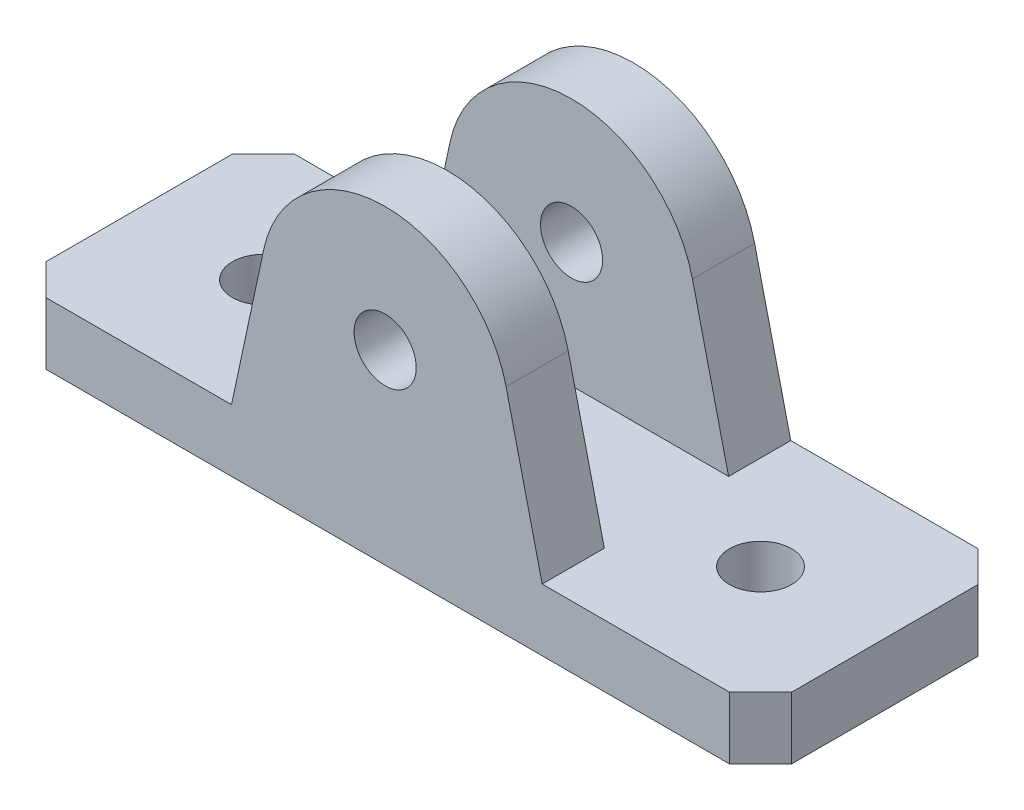
ISO-10303-21;
HEADER;
FILE_DESCRIPTION(('STEP AP214'),'2;1');
FILE_NAME('part.step','',(''),(''),'','','');
FILE_SCHEMA(('AUTOMOTIVE_DESIGN { 1 0 10303 214 1 1 1 1 }'));
ENDSEC;
DATA;
#1=APPLICATION_CONTEXT('core data for automotive mechanical design processes');
#2=APPLICATION_PROTOCOL_DEFINITION('international standard','automotive_design',2000,#1);
#3=PRODUCT_CONTEXT('',#1,'mechanical');
#4=PRODUCT('Part','Part','',(#3));
#5=PRODUCT_RELATED_PRODUCT_CATEGORY('part','',(#4));
#6=PRODUCT_DEFINITION_FORMATION('','',#4);
#7=PRODUCT_DEFINITION_CONTEXT('part definition',#1,'design');
#8=PRODUCT_DEFINITION('design','',#6,#7);
#9=PRODUCT_DEFINITION_SHAPE('','',#8);
#10=(LENGTH_UNIT() NAMED_UNIT(*) SI_UNIT(.MILLI.,.METRE.));
#11=(NAMED_UNIT(*) PLANE_ANGLE_UNIT() SI_UNIT($,.RADIAN.));
#12=(NAMED_UNIT(*) SI_UNIT($,.STERADIAN.) SOLID_ANGLE_UNIT());
#13=UNCERTAINTY_MEASURE_WITH_UNIT(LENGTH_MEASURE(1.E-05),#10,'distance_accuracy_value','');
#14=(GEOMETRIC_REPRESENTATION_CONTEXT(3) GLOBAL_UNCERTAINTY_ASSIGNED_CONTEXT((#13)) GLOBAL_UNIT_ASSIGNED_CONTEXT((#10,
#11,#12)) REPRESENTATION_CONTEXT('',''));
#15=CARTESIAN_POINT('',(0.,0.,0.));
#16=DIRECTION('',(0.,0.,1.));
#17=DIRECTION('',(1.,0.,0.));
#18=AXIS2_PLACEMENT_3D('',#15,#16,#17);
#19=CARTESIAN_POINT('',(-0.0602082119605798,11.8200017497807,0.));
#20=DIRECTION('',(0.,1.,0.));
#21=DIRECTION('',(0.,0.,1.));
#22=AXIS2_PLACEMENT_3D('',#19,#20,#21);
#23=PLANE('',#22);
#24=CARTESIAN_POINT('',(19.9397917880394,11.8200017497807,0.));
#25=DIRECTION('',(0.,1.,0.));
#26=DIRECTION('',(0.,0.,1.));
#27=AXIS2_PLACEMENT_3D('',#24,#25,#26);
#28=CIRCLE('',#27,2.5);
#29=CARTESIAN_POINT('',(19.9397917880394,11.8200017497807,2.49999999999999));
#30=VERTEX_POINT('',#29);
#31=EDGE_CURVE('E543',#30,#30,#28,.T.);
#32=ORIENTED_EDGE('',*,*,#31,.F.);
#33=EDGE_LOOP('',(#32));
#34=FACE_BOUND('',#33,.T.);
#35=CARTESIAN_POINT('',(-20.0602082119606,11.8200017497807,0.));
#36=DIRECTION('',(0.,1.,0.));
#37=DIRECTION('',(0.,0.,-1.));
#38=AXIS2_PLACEMENT_3D('',#35,#36,#37);
#39=CIRCLE('',#38,2.5);
#40=CARTESIAN_POINT('',(-20.0602082119606,11.8200017497807,-2.5));
#41=VERTEX_POINT('',#40);
#42=EDGE_CURVE('E552',#41,#41,#39,.T.);
#43=ORIENTED_EDGE('',*,*,#42,.F.);
#44=EDGE_LOOP('',(#43));
#45=FACE_BOUND('',#44,.T.);
#46=DIRECTION('',(-1.,0.,0.));
#47=VECTOR('',#46,1.);
#48=CARTESIAN_POINT('',(29.9397917880394,11.8200017497807,-10.));
#49=LINE('',#48,#47);
#50=CARTESIAN_POINT('',(-12.6297461845809,11.8200017497807,-10.));
#51=VERTEX_POINT('',#50);
#52=CARTESIAN_POINT('',(-27.5602082119606,11.8200017497807,-10.));
#53=VERTEX_POINT('',#52);
#54=EDGE_CURVE('E243',#51,#53,#49,.T.);
#55=ORIENTED_EDGE('',*,*,#54,.T.);
#56=DIRECTION('',(0.70710678118655,0.,-0.707106781186546));
#57=VECTOR('',#56,1.);
#58=CARTESIAN_POINT('',(-18.8102082119605,11.8200017497807,-18.75));
#59=LINE('',#58,#57);
#60=CARTESIAN_POINT('',(-30.0602082119606,11.8200017497807,-7.50000000000001));
#61=VERTEX_POINT('',#60);
#62=EDGE_CURVE('E278',#53,#61,#59,.F.);
#63=ORIENTED_EDGE('',*,*,#62,.T.);
#64=DIRECTION('',(0.,0.,1.));
#65=VECTOR('',#64,1.);
#66=CARTESIAN_POINT('',(-30.0602082119606,11.8200017497807,10.));
#67=LINE('',#66,#65);
#68=CARTESIAN_POINT('',(-30.0602082119606,11.8200017497807,7.5));
#69=VERTEX_POINT('',#68);
#70=EDGE_CURVE('E234',#61,#69,#67,.T.);
#71=ORIENTED_EDGE('',*,*,#70,.T.);
#72=DIRECTION('',(-0.707106781186547,0.,-0.707106781186549));
#73=VECTOR('',#72,1.);
#74=CARTESIAN_POINT('',(-18.8102082119606,11.8200017497807,18.75));
#75=LINE('',#74,#73);
#76=CARTESIAN_POINT('',(-27.5602082119606,11.8200017497807,10.));
#77=VERTEX_POINT('',#76);
#78=EDGE_CURVE('E276',#69,#77,#75,.F.);
#79=ORIENTED_EDGE('',*,*,#78,.T.);
#80=DIRECTION('',(1.,0.,0.));
#81=VECTOR('',#80,1.);
#82=CARTESIAN_POINT('',(29.9397917880394,11.8200017497807,9.99999999999999));
#83=LINE('',#82,#81);
#84=CARTESIAN_POINT('',(-12.6297461845809,11.8200017497807,10.));
#85=VERTEX_POINT('',#84);
#86=EDGE_CURVE('E239',#77,#85,#83,.T.);
#87=ORIENTED_EDGE('',*,*,#86,.T.);
#88=DIRECTION('',(0.,0.,1.));
#89=VECTOR('',#88,1.);
#90=CARTESIAN_POINT('',(-12.6297461845809,11.8200017497807,5.));
#91=LINE('',#90,#89);
#92=CARTESIAN_POINT('',(-12.6297461845809,11.8200017497807,5.));
#93=VERTEX_POINT('',#92);
#94=EDGE_CURVE('E230',#93,#85,#91,.T.);
#95=ORIENTED_EDGE('',*,*,#94,.F.);
#96=DIRECTION('',(1.,0.,0.));
#97=VECTOR('',#96,1.);
#98=CARTESIAN_POINT('',(12.3702538154191,11.8200017497807,5.));
#99=LINE('',#98,#97);
#100=CARTESIAN_POINT('',(12.3702538154191,11.8200017497807,5.));
#101=VERTEX_POINT('',#100);
#102=EDGE_CURVE('E210',#93,#101,#99,.T.);
#103=ORIENTED_EDGE('',*,*,#102,.T.);
#104=DIRECTION('',(0.,0.,1.));
#105=VECTOR('',#104,1.);
#106=CARTESIAN_POINT('',(12.3702538154191,11.8200017497807,5.));
#107=LINE('',#106,#105);
#108=CARTESIAN_POINT('',(12.3702538154191,11.8200017497807,9.99999999999999));
#109=VERTEX_POINT('',#108);
#110=EDGE_CURVE('E227',#101,#109,#107,.T.);
#111=ORIENTED_EDGE('',*,*,#110,.T.);
#112=CARTESIAN_POINT('',(27.4397917880394,11.8200017497807,9.99999999999999));
#113=VERTEX_POINT('',#112);
#114=EDGE_CURVE('E237',#109,#113,#83,.T.);
#115=ORIENTED_EDGE('',*,*,#114,.T.);
#116=DIRECTION('',(-0.707106781186549,0.,0.707106781186546));
#117=VECTOR('',#116,1.);
#118=CARTESIAN_POINT('',(18.6897917880393,11.8200017497807,18.75));
#119=LINE('',#118,#117);
#120=CARTESIAN_POINT('',(29.9397917880394,11.8200017497807,7.50000000000001));
#121=VERTEX_POINT('',#120);
#122=EDGE_CURVE('E58',#113,#121,#119,.F.);
#123=ORIENTED_EDGE('',*,*,#122,.T.);
#124=DIRECTION('',(0.,0.,-1.));
#125=VECTOR('',#124,1.);
#126=CARTESIAN_POINT('',(29.9397917880394,11.8200017497807,9.99999999999999));
#127=LINE('',#126,#125);
#128=CARTESIAN_POINT('',(29.9397917880394,11.8200017497807,-7.50000000000001));
#129=VERTEX_POINT('',#128);
#130=EDGE_CURVE('E241',#121,#129,#127,.T.);
#131=ORIENTED_EDGE('',*,*,#130,.T.);
#132=DIRECTION('',(0.707106781186547,0.,0.707106781186549));
#133=VECTOR('',#132,1.);
#134=CARTESIAN_POINT('',(18.6897917880395,11.8200017497807,-18.75));
#135=LINE('',#134,#133);
#136=CARTESIAN_POINT('',(27.4397917880394,11.8200017497807,-10.));
#137=VERTEX_POINT('',#136);
#138=EDGE_CURVE('E274',#129,#137,#135,.F.);
#139=ORIENTED_EDGE('',*,*,#138,.T.);
#140=CARTESIAN_POINT('',(12.3702538154191,11.8200017497807,-10.));
#141=VERTEX_POINT('',#140);
#142=EDGE_CURVE('E244',#137,#141,#49,.T.);
#143=ORIENTED_EDGE('',*,*,#142,.T.);
#144=DIRECTION('',(0.,0.,-1.));
#145=VECTOR('',#144,1.);
#146=CARTESIAN_POINT('',(12.3702538154191,11.8200017497807,-5.));
#147=LINE('',#146,#145);
#148=CARTESIAN_POINT('',(12.3702538154191,11.8200017497807,-5.));
#149=VERTEX_POINT('',#148);
#150=EDGE_CURVE('E172',#149,#141,#147,.T.);
#151=ORIENTED_EDGE('',*,*,#150,.F.);
#152=DIRECTION('',(1.,0.,0.));
#153=VECTOR('',#152,1.);
#154=CARTESIAN_POINT('',(12.3702538154191,11.8200017497807,-5.));
#155=LINE('',#154,#153);
#156=CARTESIAN_POINT('',(-12.6297461845809,11.8200017497807,-5.));
#157=VERTEX_POINT('',#156);
#158=EDGE_CURVE('E159',#157,#149,#155,.T.);
#159=ORIENTED_EDGE('',*,*,#158,.F.);
#160=DIRECTION('',(0.,0.,-1.));
#161=VECTOR('',#160,1.);
#162=CARTESIAN_POINT('',(-12.6297461845809,11.8200017497807,-5.));
#163=LINE('',#162,#161);
#164=EDGE_CURVE('E193',#157,#51,#163,.T.);
#165=ORIENTED_EDGE('',*,*,#164,.T.);
#166=EDGE_LOOP('',(#55,#63,#71,#79,#87,#95,#103,#111,#115,#123,#131,#139,#143,#151,#159,#165));
#167=FACE_BOUND('',#166,.T.);
#168=ADVANCED_FACE('F38',(#34,#45,#167),#23,.T.);
#169=CARTESIAN_POINT('',(-30.0602082119606,11.8200017497807,10.));
#170=DIRECTION('',(1.,0.,0.));
#171=DIRECTION('',(0.,0.,-1.));
#172=AXIS2_PLACEMENT_3D('',#169,#170,#171);
#173=PLANE('',#172);
#174=ORIENTED_EDGE('',*,*,#70,.F.);
#175=DIRECTION('',(0.,-1.,0.));
#176=VECTOR('',#175,1.);
#177=CARTESIAN_POINT('',(-30.0602082119606,11.8200017497807,-7.50000000000001));
#178=LINE('',#177,#176);
#179=CARTESIAN_POINT('',(-30.0602082119606,6.82000174978073,-7.50000000000001));
#180=VERTEX_POINT('',#179);
#181=EDGE_CURVE('E257',#61,#180,#178,.T.);
#182=ORIENTED_EDGE('',*,*,#181,.T.);
#183=DIRECTION('',(0.,0.,1.));
#184=VECTOR('',#183,1.);
#185=CARTESIAN_POINT('',(-30.0602082119606,6.82000174978073,10.));
#186=LINE('',#185,#184);
#187=CARTESIAN_POINT('',(-30.0602082119606,6.82000174978073,7.5));
#188=VERTEX_POINT('',#187);
#189=EDGE_CURVE('E226',#180,#188,#186,.T.);
#190=ORIENTED_EDGE('',*,*,#189,.T.);
#191=DIRECTION('',(0.,1.,0.));
#192=VECTOR('',#191,1.);
#193=CARTESIAN_POINT('',(-30.0602082119606,11.8200017497807,7.5));
#194=LINE('',#193,#192);
#195=EDGE_CURVE('E246',#188,#69,#194,.T.);
#196=ORIENTED_EDGE('',*,*,#195,.T.);
#197=EDGE_LOOP('',(#174,#182,#190,#196));
#198=FACE_BOUND('',#197,.T.);
#199=ADVANCED_FACE('F314',(#198),#173,.F.);
#200=CARTESIAN_POINT('',(29.9397917880394,11.8200017497807,9.99999999999999));
#201=DIRECTION('',(0.,0.,-1.));
#202=DIRECTION('',(-1.,0.,0.));
#203=AXIS2_PLACEMENT_3D('',#200,#201,#202);
#204=PLANE('',#203);
#205=ORIENTED_EDGE('',*,*,#86,.F.);
#206=DIRECTION('',(0.,-1.,0.));
#207=VECTOR('',#206,1.);
#208=CARTESIAN_POINT('',(-27.5602082119606,11.8200017497807,10.));
#209=LINE('',#208,#207);
#210=CARTESIAN_POINT('',(-27.5602082119606,6.82000174978073,10.));
#211=VERTEX_POINT('',#210);
#212=EDGE_CURVE('E282',#77,#211,#209,.T.);
#213=ORIENTED_EDGE('',*,*,#212,.T.);
#214=DIRECTION('',(1.,0.,0.));
#215=VECTOR('',#214,1.);
#216=CARTESIAN_POINT('',(29.9397917880394,6.82000174978073,9.99999999999999));
#217=LINE('',#216,#215);
#218=CARTESIAN_POINT('',(27.4397917880394,6.82000174978073,9.99999999999999));
#219=VERTEX_POINT('',#218);
#220=EDGE_CURVE('E249',#211,#219,#217,.T.);
#221=ORIENTED_EDGE('',*,*,#220,.T.);
#222=DIRECTION('',(0.,1.,0.));
#223=VECTOR('',#222,1.);
#224=CARTESIAN_POINT('',(27.4397917880394,11.8200017497807,9.99999999999999));
#225=LINE('',#224,#223);
#226=EDGE_CURVE('E280',#219,#113,#225,.T.);
#227=ORIENTED_EDGE('',*,*,#226,.T.);
#228=ORIENTED_EDGE('',*,*,#114,.F.);
#229=DIRECTION('',(-0.230017730293803,0.973186438330543,0.));
#230=VECTOR('',#229,1.);
#231=CARTESIAN_POINT('',(9.46304225348381,24.1201790527188,10.));
#232=LINE('',#231,#230);
#233=CARTESIAN_POINT('',(9.46304225348381,24.1201790527188,10.));
#234=VERTEX_POINT('',#233);
#235=EDGE_CURVE('E207',#109,#234,#232,.T.);
#236=ORIENTED_EDGE('',*,*,#235,.T.);
#237=CARTESIAN_POINT('',(-0.268822129821622,21.8200017497807,10.));
#238=DIRECTION('',(0.,0.,1.));
#239=DIRECTION('',(-1.,0.,0.));
#240=AXIS2_PLACEMENT_3D('',#237,#238,#239);
#241=CIRCLE('',#240,10.);
#242=CARTESIAN_POINT('',(-10.048326520244,23.9083728561003,10.));
#243=VERTEX_POINT('',#242);
#244=EDGE_CURVE('E200',#234,#243,#241,.T.);
#245=ORIENTED_EDGE('',*,*,#244,.T.);
#246=DIRECTION('',(-0.208837110631956,-0.977950439042233,0.));
#247=VECTOR('',#246,1.);
#248=CARTESIAN_POINT('',(-10.048326520244,23.9083728561003,10.));
#249=LINE('',#248,#247);
#250=EDGE_CURVE('E219',#243,#85,#249,.T.);
#251=ORIENTED_EDGE('',*,*,#250,.T.);
#252=EDGE_LOOP('',(#205,#213,#221,#227,#228,#236,#245,#251));
#253=FACE_BOUND('',#252,.T.);
#254=CARTESIAN_POINT('',(-0.268822129821622,21.8200017497807,10.));
#255=DIRECTION('',(0.,0.,1.));
#256=DIRECTION('',(1.,0.,0.));
#257=AXIS2_PLACEMENT_3D('',#254,#255,#256);
#258=CIRCLE('',#257,2.5);
#259=CARTESIAN_POINT('',(2.23117787017838,21.8200017497807,10.));
#260=VERTEX_POINT('',#259);
#261=EDGE_CURVE('E192',#260,#260,#258,.T.);
#262=ORIENTED_EDGE('',*,*,#261,.F.);
#263=EDGE_LOOP('',(#262));
#264=FACE_BOUND('',#263,.T.);
#265=ADVANCED_FACE('F322',(#253,#264),#204,.F.);
#266=CARTESIAN_POINT('',(29.9397917880394,11.8200017497807,9.99999999999999));
#267=DIRECTION('',(-1.,0.,0.));
#268=DIRECTION('',(0.,0.,1.));
#269=AXIS2_PLACEMENT_3D('',#266,#267,#268);
#270=PLANE('',#269);
#271=DIRECTION('',(0.,0.,-1.));
#272=VECTOR('',#271,1.);
#273=CARTESIAN_POINT('',(29.9397917880394,6.82000174978073,9.99999999999999));
#274=LINE('',#273,#272);
#275=CARTESIAN_POINT('',(29.9397917880394,6.82000174978073,7.50000000000001));
#276=VERTEX_POINT('',#275);
#277=CARTESIAN_POINT('',(29.9397917880394,6.82000174978073,-7.50000000000001));
#278=VERTEX_POINT('',#277);
#279=EDGE_CURVE('E252',#276,#278,#274,.T.);
#280=ORIENTED_EDGE('',*,*,#279,.T.);
#281=DIRECTION('',(0.,1.,0.));
#282=VECTOR('',#281,1.);
#283=CARTESIAN_POINT('',(29.9397917880394,11.8200017497807,-7.50000000000001));
#284=LINE('',#283,#282);
#285=EDGE_CURVE('E11',#278,#129,#284,.T.);
#286=ORIENTED_EDGE('',*,*,#285,.T.);
#287=ORIENTED_EDGE('',*,*,#130,.F.);
#288=DIRECTION('',(0.,-1.,0.));
#289=VECTOR('',#288,1.);
#290=CARTESIAN_POINT('',(29.9397917880394,11.8200017497807,7.50000000000001));
#291=LINE('',#290,#289);
#292=EDGE_CURVE('E46',#121,#276,#291,.T.);
#293=ORIENTED_EDGE('',*,*,#292,.T.);
#294=EDGE_LOOP('',(#280,#286,#287,#293));
#295=FACE_BOUND('',#294,.T.);
#296=ADVANCED_FACE('F287',(#295),#270,.F.);
#297=CARTESIAN_POINT('',(29.9397917880394,11.8200017497807,-10.));
#298=DIRECTION('',(0.,0.,1.));
#299=DIRECTION('',(1.,0.,0.));
#300=AXIS2_PLACEMENT_3D('',#297,#298,#299);
#301=PLANE('',#300);
#302=DIRECTION('',(-1.,0.,0.));
#303=VECTOR('',#302,1.);
#304=CARTESIAN_POINT('',(29.9397917880394,6.82000174978073,-10.));
#305=LINE('',#304,#303);
#306=CARTESIAN_POINT('',(27.4397917880394,6.82000174978073,-10.));
#307=VERTEX_POINT('',#306);
#308=CARTESIAN_POINT('',(-27.5602082119606,6.82000174978073,-10.));
#309=VERTEX_POINT('',#308);
#310=EDGE_CURVE('E238',#307,#309,#305,.T.);
#311=ORIENTED_EDGE('',*,*,#310,.T.);
#312=DIRECTION('',(0.,1.,0.));
#313=VECTOR('',#312,1.);
#314=CARTESIAN_POINT('',(-27.5602082119606,11.8200017497807,-10.));
#315=LINE('',#314,#313);
#316=EDGE_CURVE('E271',#309,#53,#315,.T.);
#317=ORIENTED_EDGE('',*,*,#316,.T.);
#318=ORIENTED_EDGE('',*,*,#54,.F.);
#319=DIRECTION('',(-0.208837110631956,-0.977950439042233,0.));
#320=VECTOR('',#319,1.);
#321=CARTESIAN_POINT('',(-10.048326520244,23.9083728561003,-10.));
#322=LINE('',#321,#320);
#323=CARTESIAN_POINT('',(-10.048326520244,23.9083728561003,-10.));
#324=VERTEX_POINT('',#323);
#325=EDGE_CURVE('E178',#324,#51,#322,.T.);
#326=ORIENTED_EDGE('',*,*,#325,.F.);
#327=CARTESIAN_POINT('',(-0.268822129821622,21.8200017497807,-10.));
#328=DIRECTION('',(0.,0.,1.));
#329=DIRECTION('',(-1.,0.,0.));
#330=AXIS2_PLACEMENT_3D('',#327,#328,#329);
#331=CIRCLE('',#330,10.);
#332=CARTESIAN_POINT('',(9.46304225348381,24.1201790527188,-10.));
#333=VERTEX_POINT('',#332);
#334=EDGE_CURVE('E187',#333,#324,#331,.T.);
#335=ORIENTED_EDGE('',*,*,#334,.F.);
#336=DIRECTION('',(-0.230017730293803,0.973186438330543,0.));
#337=VECTOR('',#336,1.);
#338=CARTESIAN_POINT('',(9.46304225348381,24.1201790527188,-10.));
#339=LINE('',#338,#337);
#340=EDGE_CURVE('E168',#141,#333,#339,.T.);
#341=ORIENTED_EDGE('',*,*,#340,.F.);
#342=ORIENTED_EDGE('',*,*,#142,.F.);
#343=DIRECTION('',(0.,-1.,0.));
#344=VECTOR('',#343,1.);
#345=CARTESIAN_POINT('',(27.4397917880394,11.8200017497807,-10.));
#346=LINE('',#345,#344);
#347=EDGE_CURVE('E268',#137,#307,#346,.T.);
#348=ORIENTED_EDGE('',*,*,#347,.T.);
#349=EDGE_LOOP('',(#311,#317,#318,#326,#335,#341,#342,#348));
#350=FACE_BOUND('',#349,.T.);
#351=CARTESIAN_POINT('',(-0.268822129821622,21.8200017497807,-10.));
#352=DIRECTION('',(0.,0.,1.));
#353=DIRECTION('',(1.,0.,0.));
#354=AXIS2_PLACEMENT_3D('',#351,#352,#353);
#355=CIRCLE('',#354,2.5);
#356=CARTESIAN_POINT('',(2.23117787017838,21.8200017497807,-10.));
#357=VERTEX_POINT('',#356);
#358=EDGE_CURVE('E182',#357,#357,#355,.T.);
#359=ORIENTED_EDGE('',*,*,#358,.T.);
#360=EDGE_LOOP('',(#359));
#361=FACE_BOUND('',#360,.T.);
#362=ADVANCED_FACE('F300',(#350,#361),#301,.F.);
#363=CARTESIAN_POINT('',(-0.0602082119605798,6.82000174978073,0.));
#364=DIRECTION('',(0.,1.,0.));
#365=DIRECTION('',(0.,0.,1.));
#366=AXIS2_PLACEMENT_3D('',#363,#364,#365);
#367=PLANE('',#366);
#368=CARTESIAN_POINT('',(19.9397917880394,6.82000174978073,0.));
#369=DIRECTION('',(0.,1.,0.));
#370=DIRECTION('',(0.,0.,1.));
#371=AXIS2_PLACEMENT_3D('',#368,#369,#370);
#372=CIRCLE('',#371,2.5);
#373=CARTESIAN_POINT('',(19.9397917880394,6.82000174978073,2.49999999999999));
#374=VERTEX_POINT('',#373);
#375=EDGE_CURVE('E541',#374,#374,#372,.T.);
#376=ORIENTED_EDGE('',*,*,#375,.T.);
#377=EDGE_LOOP('',(#376));
#378=FACE_BOUND('',#377,.T.);
#379=CARTESIAN_POINT('',(-20.0602082119606,6.82000174978073,0.));
#380=DIRECTION('',(0.,1.,0.));
#381=DIRECTION('',(0.,0.,-1.));
#382=AXIS2_PLACEMENT_3D('',#379,#380,#381);
#383=CIRCLE('',#382,2.5);
#384=CARTESIAN_POINT('',(-20.0602082119606,6.82000174978073,-2.5));
#385=VERTEX_POINT('',#384);
#386=EDGE_CURVE('E547',#385,#385,#383,.T.);
#387=ORIENTED_EDGE('',*,*,#386,.T.);
#388=EDGE_LOOP('',(#387));
#389=FACE_BOUND('',#388,.T.);
#390=ORIENTED_EDGE('',*,*,#189,.F.);
#391=DIRECTION('',(-0.70710678118655,0.,0.707106781186546));
#392=VECTOR('',#391,1.);
#393=CARTESIAN_POINT('',(-30.0602082119606,6.82000174978073,-7.50000000000001));
#394=LINE('',#393,#392);
#395=EDGE_CURVE('E266',#180,#309,#394,.F.);
#396=ORIENTED_EDGE('',*,*,#395,.T.);
#397=ORIENTED_EDGE('',*,*,#310,.F.);
#398=DIRECTION('',(-0.707106781186547,0.,-0.707106781186549));
#399=VECTOR('',#398,1.);
#400=CARTESIAN_POINT('',(27.4397917880394,6.82000174978073,-10.));
#401=LINE('',#400,#399);
#402=EDGE_CURVE('E262',#307,#278,#401,.F.);
#403=ORIENTED_EDGE('',*,*,#402,.T.);
#404=ORIENTED_EDGE('',*,*,#279,.F.);
#405=DIRECTION('',(0.707106781186549,0.,-0.707106781186546));
#406=VECTOR('',#405,1.);
#407=CARTESIAN_POINT('',(29.9397917880394,6.82000174978073,7.50000000000001));
#408=LINE('',#407,#406);
#409=EDGE_CURVE('E260',#276,#219,#408,.F.);
#410=ORIENTED_EDGE('',*,*,#409,.T.);
#411=ORIENTED_EDGE('',*,*,#220,.F.);
#412=DIRECTION('',(0.707106781186547,0.,0.707106781186549));
#413=VECTOR('',#412,1.);
#414=CARTESIAN_POINT('',(-27.5602082119606,6.82000174978073,10.));
#415=LINE('',#414,#413);
#416=EDGE_CURVE('E264',#211,#188,#415,.F.);
#417=ORIENTED_EDGE('',*,*,#416,.T.);
#418=EDGE_LOOP('',(#390,#396,#397,#403,#404,#410,#411,#417));
#419=FACE_BOUND('',#418,.T.);
#420=ADVANCED_FACE('F291',(#378,#389,#419),#367,.F.);
#421=CARTESIAN_POINT('',(-0.268822129821622,21.8200017497807,5.));
#422=DIRECTION('',(0.,0.,1.));
#423=DIRECTION('',(1.,0.,0.));
#424=AXIS2_PLACEMENT_3D('',#421,#422,#423);
#425=CYLINDRICAL_SURFACE('',#424,10.);
#426=ORIENTED_EDGE('',*,*,#244,.F.);
#427=DIRECTION('',(0.,0.,1.));
#428=VECTOR('',#427,1.);
#429=CARTESIAN_POINT('',(9.46304225348381,24.1201790527188,5.));
#430=LINE('',#429,#428);
#431=CARTESIAN_POINT('',(9.46304225348381,24.1201790527188,5.));
#432=VERTEX_POINT('',#431);
#433=EDGE_CURVE('E224',#432,#234,#430,.T.);
#434=ORIENTED_EDGE('',*,*,#433,.F.);
#435=CARTESIAN_POINT('',(-0.268822129821622,21.8200017497807,5.));
#436=DIRECTION('',(0.,0.,1.));
#437=DIRECTION('',(-1.,0.,0.));
#438=AXIS2_PLACEMENT_3D('',#435,#436,#437);
#439=CIRCLE('',#438,10.);
#440=CARTESIAN_POINT('',(-10.048326520244,23.9083728561003,5.));
#441=VERTEX_POINT('',#440);
#442=EDGE_CURVE('E203',#432,#441,#439,.T.);
#443=ORIENTED_EDGE('',*,*,#442,.T.);
#444=DIRECTION('',(0.,0.,1.));
#445=VECTOR('',#444,1.);
#446=CARTESIAN_POINT('',(-10.048326520244,23.9083728561003,5.));
#447=LINE('',#446,#445);
#448=EDGE_CURVE('E216',#441,#243,#447,.T.);
#449=ORIENTED_EDGE('',*,*,#448,.T.);
#450=EDGE_LOOP('',(#426,#434,#443,#449));
#451=FACE_BOUND('',#450,.T.);
#452=ADVANCED_FACE('F357',(#451),#425,.T.);
#453=CARTESIAN_POINT('',(9.46304225348381,24.1201790527188,5.));
#454=DIRECTION('',(0.973186438330543,0.230017730293803,0.));
#455=DIRECTION('',(-0.230017730293803,0.973186438330543,0.));
#456=AXIS2_PLACEMENT_3D('',#453,#454,#455);
#457=PLANE('',#456);
#458=ORIENTED_EDGE('',*,*,#235,.F.);
#459=ORIENTED_EDGE('',*,*,#110,.F.);
#460=DIRECTION('',(-0.230017730293803,0.973186438330543,0.));
#461=VECTOR('',#460,1.);
#462=CARTESIAN_POINT('',(9.46304225348381,24.1201790527188,5.));
#463=LINE('',#462,#461);
#464=EDGE_CURVE('E213',#101,#432,#463,.T.);
#465=ORIENTED_EDGE('',*,*,#464,.T.);
#466=ORIENTED_EDGE('',*,*,#433,.T.);
#467=EDGE_LOOP('',(#458,#459,#465,#466));
#468=FACE_BOUND('',#467,.T.);
#469=ADVANCED_FACE('F335',(#468),#457,.T.);
#470=CARTESIAN_POINT('',(-10.048326520244,23.9083728561003,5.));
#471=DIRECTION('',(-0.977950439042233,0.208837110631956,0.));
#472=DIRECTION('',(-0.208837110631956,-0.977950439042233,0.));
#473=AXIS2_PLACEMENT_3D('',#470,#471,#472);
#474=PLANE('',#473);
#475=ORIENTED_EDGE('',*,*,#250,.F.);
#476=ORIENTED_EDGE('',*,*,#448,.F.);
#477=DIRECTION('',(-0.208837110631956,-0.977950439042233,0.));
#478=VECTOR('',#477,1.);
#479=CARTESIAN_POINT('',(-10.048326520244,23.9083728561003,5.));
#480=LINE('',#479,#478);
#481=EDGE_CURVE('E206',#441,#93,#480,.T.);
#482=ORIENTED_EDGE('',*,*,#481,.T.);
#483=ORIENTED_EDGE('',*,*,#94,.T.);
#484=EDGE_LOOP('',(#475,#476,#482,#483));
#485=FACE_BOUND('',#484,.T.);
#486=ADVANCED_FACE('F327',(#485),#474,.T.);
#487=CARTESIAN_POINT('',(-0.268822129821622,21.8200017497807,5.));
#488=DIRECTION('',(0.,0.,-1.));
#489=DIRECTION('',(-1.,0.,0.));
#490=AXIS2_PLACEMENT_3D('',#487,#488,#489);
#491=PLANE('',#490);
#492=CARTESIAN_POINT('',(-0.268822129821622,21.8200017497807,5.));
#493=DIRECTION('',(0.,0.,1.));
#494=DIRECTION('',(1.,0.,0.));
#495=AXIS2_PLACEMENT_3D('',#492,#493,#494);
#496=CIRCLE('',#495,2.5);
#497=CARTESIAN_POINT('',(2.23117787017838,21.8200017497807,5.));
#498=VERTEX_POINT('',#497);
#499=EDGE_CURVE('E197',#498,#498,#496,.T.);
#500=ORIENTED_EDGE('',*,*,#499,.T.);
#501=EDGE_LOOP('',(#500));
#502=FACE_BOUND('',#501,.T.);
#503=ORIENTED_EDGE('',*,*,#442,.F.);
#504=ORIENTED_EDGE('',*,*,#464,.F.);
#505=ORIENTED_EDGE('',*,*,#102,.F.);
#506=ORIENTED_EDGE('',*,*,#481,.F.);
#507=EDGE_LOOP('',(#503,#504,#505,#506));
#508=FACE_BOUND('',#507,.T.);
#509=ADVANCED_FACE('F333',(#502,#508),#491,.T.);
#510=CARTESIAN_POINT('',(-0.268822129821622,21.8200017497807,5.));
#511=DIRECTION('',(0.,0.,1.));
#512=DIRECTION('',(1.,0.,0.));
#513=AXIS2_PLACEMENT_3D('',#510,#511,#512);
#514=CYLINDRICAL_SURFACE('',#513,2.5);
#515=ORIENTED_EDGE('',*,*,#499,.F.);
#516=EDGE_LOOP('',(#515));
#517=FACE_BOUND('',#516,.T.);
#518=ORIENTED_EDGE('',*,*,#261,.T.);
#519=EDGE_LOOP('',(#518));
#520=FACE_BOUND('',#519,.T.);
#521=ADVANCED_FACE('F422',(#517,#520),#514,.F.);
#522=CARTESIAN_POINT('',(-0.268822129821622,21.8200017497807,-5.));
#523=DIRECTION('',(0.,0.,1.));
#524=DIRECTION('',(-1.,0.,0.));
#525=AXIS2_PLACEMENT_3D('',#522,#523,#524);
#526=PLANE('',#525);
#527=CARTESIAN_POINT('',(-0.268822129821622,21.8200017497807,-5.));
#528=DIRECTION('',(0.,0.,1.));
#529=DIRECTION('',(-1.,0.,0.));
#530=AXIS2_PLACEMENT_3D('',#527,#528,#529);
#531=CIRCLE('',#530,10.);
#532=CARTESIAN_POINT('',(9.46304225348381,24.1201790527188,-5.));
#533=VERTEX_POINT('',#532);
#534=CARTESIAN_POINT('',(-10.048326520244,23.9083728561003,-5.));
#535=VERTEX_POINT('',#534);
#536=EDGE_CURVE('E156',#533,#535,#531,.T.);
#537=ORIENTED_EDGE('',*,*,#536,.T.);
#538=DIRECTION('',(-0.208837110631956,-0.977950439042233,0.));
#539=VECTOR('',#538,1.);
#540=CARTESIAN_POINT('',(-10.048326520244,23.9083728561003,-5.));
#541=LINE('',#540,#539);
#542=EDGE_CURVE('E173',#535,#157,#541,.T.);
#543=ORIENTED_EDGE('',*,*,#542,.T.);
#544=ORIENTED_EDGE('',*,*,#158,.T.);
#545=DIRECTION('',(-0.230017730293803,0.973186438330543,0.));
#546=VECTOR('',#545,1.);
#547=CARTESIAN_POINT('',(9.46304225348381,24.1201790527188,-5.));
#548=LINE('',#547,#546);
#549=EDGE_CURVE('E151',#149,#533,#548,.T.);
#550=ORIENTED_EDGE('',*,*,#549,.T.);
#551=EDGE_LOOP('',(#537,#543,#544,#550));
#552=FACE_BOUND('',#551,.T.);
#553=CARTESIAN_POINT('',(-0.268822129821622,21.8200017497807,-5.));
#554=DIRECTION('',(0.,0.,1.));
#555=DIRECTION('',(1.,0.,0.));
#556=AXIS2_PLACEMENT_3D('',#553,#554,#555);
#557=CIRCLE('',#556,2.5);
#558=CARTESIAN_POINT('',(2.23117787017838,21.8200017497807,-5.));
#559=VERTEX_POINT('',#558);
#560=EDGE_CURVE('E189',#559,#559,#557,.T.);
#561=ORIENTED_EDGE('',*,*,#560,.F.);
#562=EDGE_LOOP('',(#561));
#563=FACE_BOUND('',#562,.T.);
#564=ADVANCED_FACE('F153',(#552,#563),#526,.T.);
#565=CARTESIAN_POINT('',(-0.268822129821622,21.8200017497807,-5.));
#566=DIRECTION('',(0.,0.,-1.));
#567=DIRECTION('',(-1.,0.,0.));
#568=AXIS2_PLACEMENT_3D('',#565,#566,#567);
#569=CYLINDRICAL_SURFACE('',#568,10.);
#570=ORIENTED_EDGE('',*,*,#334,.T.);
#571=DIRECTION('',(0.,0.,-1.));
#572=VECTOR('',#571,1.);
#573=CARTESIAN_POINT('',(-10.048326520244,23.9083728561003,-5.));
#574=LINE('',#573,#572);
#575=EDGE_CURVE('E177',#535,#324,#574,.T.);
#576=ORIENTED_EDGE('',*,*,#575,.F.);
#577=ORIENTED_EDGE('',*,*,#536,.F.);
#578=DIRECTION('',(0.,0.,-1.));
#579=VECTOR('',#578,1.);
#580=CARTESIAN_POINT('',(9.46304225348381,24.1201790527188,-5.));
#581=LINE('',#580,#579);
#582=EDGE_CURVE('E165',#533,#333,#581,.T.);
#583=ORIENTED_EDGE('',*,*,#582,.T.);
#584=EDGE_LOOP('',(#570,#576,#577,#583));
#585=FACE_BOUND('',#584,.T.);
#586=ADVANCED_FACE('F175',(#585),#569,.T.);
#587=CARTESIAN_POINT('',(-10.048326520244,23.9083728561003,-5.));
#588=DIRECTION('',(0.977950439042233,-0.208837110631956,0.));
#589=DIRECTION('',(0.208837110631956,0.977950439042233,0.));
#590=AXIS2_PLACEMENT_3D('',#587,#588,#589);
#591=PLANE('',#590);
#592=ORIENTED_EDGE('',*,*,#325,.T.);
#593=ORIENTED_EDGE('',*,*,#164,.F.);
#594=ORIENTED_EDGE('',*,*,#542,.F.);
#595=ORIENTED_EDGE('',*,*,#575,.T.);
#596=EDGE_LOOP('',(#592,#593,#594,#595));
#597=FACE_BOUND('',#596,.T.);
#598=ADVANCED_FACE('F427',(#597),#591,.F.);
#599=CARTESIAN_POINT('',(9.46304225348381,24.1201790527188,-5.));
#600=DIRECTION('',(-0.973186438330543,-0.230017730293803,0.));
#601=DIRECTION('',(0.230017730293803,-0.973186438330543,0.));
#602=AXIS2_PLACEMENT_3D('',#599,#600,#601);
#603=PLANE('',#602);
#604=ORIENTED_EDGE('',*,*,#340,.T.);
#605=ORIENTED_EDGE('',*,*,#582,.F.);
#606=ORIENTED_EDGE('',*,*,#549,.F.);
#607=ORIENTED_EDGE('',*,*,#150,.T.);
#608=EDGE_LOOP('',(#604,#605,#606,#607));
#609=FACE_BOUND('',#608,.T.);
#610=ADVANCED_FACE('F166',(#609),#603,.F.);
#611=CARTESIAN_POINT('',(-0.268822129821622,21.8200017497807,-5.));
#612=DIRECTION('',(0.,0.,-1.));
#613=DIRECTION('',(-1.,0.,0.));
#614=AXIS2_PLACEMENT_3D('',#611,#612,#613);
#615=CYLINDRICAL_SURFACE('',#614,2.5);
#616=ORIENTED_EDGE('',*,*,#560,.T.);
#617=EDGE_LOOP('',(#616));
#618=FACE_BOUND('',#617,.T.);
#619=ORIENTED_EDGE('',*,*,#358,.F.);
#620=EDGE_LOOP('',(#619));
#621=FACE_BOUND('',#620,.T.);
#622=ADVANCED_FACE('F370',(#618,#621),#615,.F.);
#623=CARTESIAN_POINT('',(-30.0602082119606,11.8200017497807,-7.50000000000001));
#624=DIRECTION('',(0.707106781186545,0.,0.707106781186549));
#625=DIRECTION('',(0.,-1.,0.));
#626=AXIS2_PLACEMENT_3D('',#623,#624,#625);
#627=PLANE('',#626);
#628=ORIENTED_EDGE('',*,*,#62,.F.);
#629=ORIENTED_EDGE('',*,*,#316,.F.);
#630=ORIENTED_EDGE('',*,*,#395,.F.);
#631=ORIENTED_EDGE('',*,*,#181,.F.);
#632=EDGE_LOOP('',(#628,#629,#630,#631));
#633=FACE_BOUND('',#632,.T.);
#634=ADVANCED_FACE('F309',(#633),#627,.F.);
#635=CARTESIAN_POINT('',(-27.5602082119606,11.8200017497807,10.));
#636=DIRECTION('',(0.707106781186548,0.,-0.707106781186546));
#637=DIRECTION('',(0.,-1.,0.));
#638=AXIS2_PLACEMENT_3D('',#635,#636,#637);
#639=PLANE('',#638);
#640=ORIENTED_EDGE('',*,*,#78,.F.);
#641=ORIENTED_EDGE('',*,*,#195,.F.);
#642=ORIENTED_EDGE('',*,*,#416,.F.);
#643=ORIENTED_EDGE('',*,*,#212,.F.);
#644=EDGE_LOOP('',(#640,#641,#642,#643));
#645=FACE_BOUND('',#644,.T.);
#646=ADVANCED_FACE('F317',(#645),#639,.F.);
#647=CARTESIAN_POINT('',(27.4397917880394,11.8200017497807,-10.));
#648=DIRECTION('',(-0.707106781186548,0.,0.707106781186546));
#649=DIRECTION('',(0.,-1.,0.));
#650=AXIS2_PLACEMENT_3D('',#647,#648,#649);
#651=PLANE('',#650);
#652=ORIENTED_EDGE('',*,*,#138,.F.);
#653=ORIENTED_EDGE('',*,*,#285,.F.);
#654=ORIENTED_EDGE('',*,*,#402,.F.);
#655=ORIENTED_EDGE('',*,*,#347,.F.);
#656=EDGE_LOOP('',(#652,#653,#654,#655));
#657=FACE_BOUND('',#656,.T.);
#658=ADVANCED_FACE('F297',(#657),#651,.F.);
#659=CARTESIAN_POINT('',(29.9397917880394,11.8200017497807,7.50000000000001));
#660=DIRECTION('',(-0.707106781186546,0.,-0.707106781186549));
#661=DIRECTION('',(0.,-1.,0.));
#662=AXIS2_PLACEMENT_3D('',#659,#660,#661);
#663=PLANE('',#662);
#664=ORIENTED_EDGE('',*,*,#122,.F.);
#665=ORIENTED_EDGE('',*,*,#226,.F.);
#666=ORIENTED_EDGE('',*,*,#409,.F.);
#667=ORIENTED_EDGE('',*,*,#292,.F.);
#668=EDGE_LOOP('',(#664,#665,#666,#667));
#669=FACE_BOUND('',#668,.T.);
#670=ADVANCED_FACE('F40',(#669),#663,.F.);
#671=CARTESIAN_POINT('',(-20.0602082119606,6.82000174978073,0.));
#672=DIRECTION('',(0.,1.,0.));
#673=DIRECTION('',(0.,0.,1.));
#674=AXIS2_PLACEMENT_3D('',#671,#672,#673);
#675=CYLINDRICAL_SURFACE('',#674,2.5);
#676=ORIENTED_EDGE('',*,*,#386,.F.);
#677=EDGE_LOOP('',(#676));
#678=FACE_BOUND('',#677,.T.);
#679=ORIENTED_EDGE('',*,*,#42,.T.);
#680=EDGE_LOOP('',(#679));
#681=FACE_BOUND('',#680,.T.);
#682=ADVANCED_FACE('F338',(#678,#681),#675,.F.);
#683=CARTESIAN_POINT('',(19.9397917880394,6.82000174978073,0.));
#684=DIRECTION('',(0.,1.,0.));
#685=DIRECTION('',(0.,0.,1.));
#686=AXIS2_PLACEMENT_3D('',#683,#684,#685);
#687=CYLINDRICAL_SURFACE('',#686,2.5);
#688=ORIENTED_EDGE('',*,*,#375,.F.);
#689=EDGE_LOOP('',(#688));
#690=FACE_BOUND('',#689,.T.);
#691=ORIENTED_EDGE('',*,*,#31,.T.);
#692=EDGE_LOOP('',(#691));
#693=FACE_BOUND('',#692,.T.);
#694=ADVANCED_FACE('F343',(#690,#693),#687,.F.);
#695=CLOSED_SHELL('',(#168,#199,#265,#296,#362,#420,#452,#469,#486,#509,#521,#564,#586,#598,
#610,#622,#634,#646,#658,#670,#682,#694));
#696=MANIFOLD_SOLID_BREP('B2',#695);
#697=ADVANCED_BREP_SHAPE_REPRESENTATION('',(#18,#696),#14);
#698=SHAPE_DEFINITION_REPRESENTATION(#9,#697);
ENDSEC;
END-ISO-10303-21;
